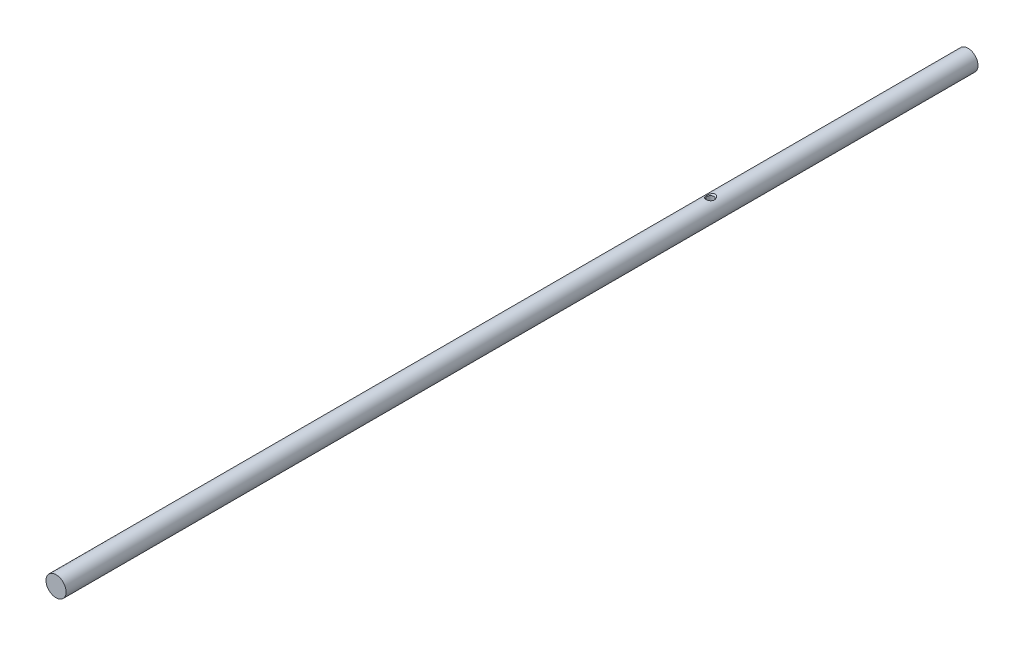
ISO-10303-21;
HEADER;
FILE_DESCRIPTION(('STEP AP214'),'2;1');
FILE_NAME('part.step','',(''),(''),'','','');
FILE_SCHEMA(('AUTOMOTIVE_DESIGN { 1 0 10303 214 1 1 1 1 }'));
ENDSEC;
DATA;
#1=APPLICATION_CONTEXT('core data for automotive mechanical design processes');
#2=APPLICATION_PROTOCOL_DEFINITION('international standard','automotive_design',2000,#1);
#3=PRODUCT_CONTEXT('',#1,'mechanical');
#4=PRODUCT('Part','Part','',(#3));
#5=PRODUCT_RELATED_PRODUCT_CATEGORY('part','',(#4));
#6=PRODUCT_DEFINITION_FORMATION('','',#4);
#7=PRODUCT_DEFINITION_CONTEXT('part definition',#1,'design');
#8=PRODUCT_DEFINITION('design','',#6,#7);
#9=PRODUCT_DEFINITION_SHAPE('','',#8);
#10=(LENGTH_UNIT() NAMED_UNIT(*) SI_UNIT(.MILLI.,.METRE.));
#11=(NAMED_UNIT(*) PLANE_ANGLE_UNIT() SI_UNIT($,.RADIAN.));
#12=(NAMED_UNIT(*) SI_UNIT($,.STERADIAN.) SOLID_ANGLE_UNIT());
#13=UNCERTAINTY_MEASURE_WITH_UNIT(LENGTH_MEASURE(1.E-05),#10,'distance_accuracy_value','');
#14=(GEOMETRIC_REPRESENTATION_CONTEXT(3) GLOBAL_UNCERTAINTY_ASSIGNED_CONTEXT((#13)) GLOBAL_UNIT_ASSIGNED_CONTEXT((#10,
#11,#12)) REPRESENTATION_CONTEXT('',''));
#15=CARTESIAN_POINT('',(0.,0.,0.));
#16=DIRECTION('',(0.,0.,1.));
#17=DIRECTION('',(1.,0.,0.));
#18=AXIS2_PLACEMENT_3D('',#15,#16,#17);
#19=CARTESIAN_POINT('',(0.,0.,431.8));
#20=DIRECTION('',(0.,0.,-1.));
#21=DIRECTION('',(-1.,0.,0.));
#22=AXIS2_PLACEMENT_3D('',#19,#20,#21);
#23=CYLINDRICAL_SURFACE('',#22,4.7625);
#24=CARTESIAN_POINT('',(0.,-4.7625,123.5075));
#25=CARTESIAN_POINT('',(0.0866193385826811,-4.76250024290249,123.507500402799));
#26=CARTESIAN_POINT('',(0.173236246329956,-4.76011509093227,123.500387577523));
#27=CARTESIAN_POINT('',(0.343918795385852,-4.75083521197708,123.472211289753));
#28=CARTESIAN_POINT('',(0.427984170888632,-4.74394001683417,123.451146378981));
#29=CARTESIAN_POINT('',(0.591078303334076,-4.72638926301478,123.395868201128));
#30=CARTESIAN_POINT('',(0.670115223594084,-4.7157399927273,123.361676913346));
#31=CARTESIAN_POINT('',(0.821332712178457,-4.6917680757628,123.281215888119));
#32=CARTESIAN_POINT('',(0.89351192417195,-4.67844490185097,123.234943768058));
#33=CARTESIAN_POINT('',(1.03146490909785,-4.6500112492827,123.129951534787));
#34=CARTESIAN_POINT('',(1.09696837422357,-4.63485795886258,123.070887915611));
#35=CARTESIAN_POINT('',(1.21734689966456,-4.60470749718205,122.942719641903));
#36=CARTESIAN_POINT('',(1.27221961946453,-4.58971036098746,122.873612782051));
#37=CARTESIAN_POINT('',(1.37132209578673,-4.56109915307672,122.724886129626));
#38=CARTESIAN_POINT('',(1.41520046242589,-4.54753724850155,122.645021188175));
#39=CARTESIAN_POINT('',(1.48878746228089,-4.52398297352029,122.478520450047));
#40=CARTESIAN_POINT('',(1.51850041960149,-4.51398951405184,122.391886729004));
#41=CARTESIAN_POINT('',(1.5618991201458,-4.49915443940136,122.217381260874));
#42=CARTESIAN_POINT('',(1.57609134913144,-4.49415052034258,122.129649681524));
#43=CARTESIAN_POINT('',(1.58962903329349,-4.48938104899343,121.952918790278));
#44=CARTESIAN_POINT('',(1.58897907629749,-4.48961387798584,121.863919878624));
#45=CARTESIAN_POINT('',(1.57324409712918,-4.49514936325486,121.69150059917));
#46=CARTESIAN_POINT('',(1.55882008715261,-4.50021985189708,121.608011160366));
#47=CARTESIAN_POINT('',(1.51702478352346,-4.51447944137724,121.444712946374));
#48=CARTESIAN_POINT('',(1.4896519397146,-4.52366903532271,121.364904613122));
#49=CARTESIAN_POINT('',(1.42230325467059,-4.54529683920857,121.209732260024));
#50=CARTESIAN_POINT('',(1.38213155232279,-4.55778498196574,121.134460509567));
#51=CARTESIAN_POINT('',(1.29046145625624,-4.58458186738965,120.991517433106));
#52=CARTESIAN_POINT('',(1.23895979087786,-4.59889113542361,120.923848310993));
#53=CARTESIAN_POINT('',(1.12291706563306,-4.62863135053788,120.79431708792));
#54=CARTESIAN_POINT('',(1.05783562574615,-4.64408185600813,120.732942597467));
#55=CARTESIAN_POINT('',(0.918114067327482,-4.67371014689421,120.621851614172));
#56=CARTESIAN_POINT('',(0.843473033111548,-4.68788781016682,120.572136239414));
#57=CARTESIAN_POINT('',(0.685716835710956,-4.71355908851247,120.485382123377));
#58=CARTESIAN_POINT('',(0.602524951310941,-4.72502468137762,120.448474032497));
#59=CARTESIAN_POINT('',(0.430639669841163,-4.7437765034179,120.389327461345));
#60=CARTESIAN_POINT('',(0.341948195570995,-4.75106418427121,120.367083885265));
#61=CARTESIAN_POINT('',(0.165709329377775,-4.76039857975912,120.338761630189));
#62=CARTESIAN_POINT('',(0.078278989785449,-4.76265877911043,120.332024052938));
#63=CARTESIAN_POINT('',(-0.0964804235618707,-4.76232383028039,120.333028119338));
#64=CARTESIAN_POINT('',(-0.183809511919939,-4.75972950165738,120.340767318968));
#65=CARTESIAN_POINT('',(-0.353250287757999,-4.75011789238403,120.369983903531));
#66=CARTESIAN_POINT('',(-0.435439830850306,-4.74323090454018,120.391056852104));
#67=CARTESIAN_POINT('',(-0.595083834245064,-4.72585806842736,120.445837093091));
#68=CARTESIAN_POINT('',(-0.672537689257405,-4.71537176124097,120.479545996655));
#69=CARTESIAN_POINT('',(-0.822782670524314,-4.69152178418573,120.559624310547));
#70=CARTESIAN_POINT('',(-0.895397560257214,-4.67808968424811,120.606303416837));
#71=CARTESIAN_POINT('',(-1.03197791784024,-4.64987090592067,120.710633213146));
#72=CARTESIAN_POINT('',(-1.09594073387547,-4.63508381455202,120.76828725395));
#73=CARTESIAN_POINT('',(-1.21642585614249,-4.60496996168956,120.896028767223));
#74=CARTESIAN_POINT('',(-1.27247803867765,-4.58964920726292,120.966562147746));
#75=CARTESIAN_POINT('',(-1.37200881668866,-4.5608870760535,121.1163623639));
#76=CARTESIAN_POINT('',(-1.41548730734047,-4.54744571493929,121.195629272332));
#77=CARTESIAN_POINT('',(-1.48843512703596,-4.52409546968822,121.360680911773));
#78=CARTESIAN_POINT('',(-1.51793278481196,-4.51417945258854,121.44645205068));
#79=CARTESIAN_POINT('',(-1.56193278348047,-4.49914696286489,121.622151106945));
#80=CARTESIAN_POINT('',(-1.57644187973937,-4.49402832815028,121.712077132579));
#81=CARTESIAN_POINT('',(-1.58952609843277,-4.48941600962757,121.888562889965));
#82=CARTESIAN_POINT('',(-1.58888153347707,-4.48964685408647,121.975058215205));
#83=CARTESIAN_POINT('',(-1.57359714084979,-4.4950264084539,122.146639556439));
#84=CARTESIAN_POINT('',(-1.55895814614049,-4.50017482566362,122.231725656004));
#85=CARTESIAN_POINT('',(-1.51665275334282,-4.51460432334016,122.396465365016));
#86=CARTESIAN_POINT('',(-1.48923906179962,-4.52380505610683,122.476191459695));
#87=CARTESIAN_POINT('',(-1.42236724314359,-4.54527283124319,122.629973508514));
#88=CARTESIAN_POINT('',(-1.38290644257916,-4.55754055411887,122.704028199511));
#89=CARTESIAN_POINT('',(-1.29105134947619,-4.58442741396349,122.847867826003));
#90=CARTESIAN_POINT('',(-1.23816783538877,-4.59912579731893,122.917325446764));
#91=CARTESIAN_POINT('',(-1.12179557697784,-4.62888578099664,123.046632578747));
#92=CARTESIAN_POINT('',(-1.05830383406673,-4.64394748298391,123.106479363905));
#93=CARTESIAN_POINT('',(-0.91954597161159,-4.67344173459301,123.217216754509));
#94=CARTESIAN_POINT('',(-0.843917402680815,-4.68782688609495,123.267667402055));
#95=CARTESIAN_POINT('',(-0.684779804883012,-4.71370010986522,123.3550848058));
#96=CARTESIAN_POINT('',(-0.6012727975351,-4.72518892253839,123.392055009151));
#97=CARTESIAN_POINT('',(-0.432583664931546,-4.7435375517131,123.449908091576));
#98=CARTESIAN_POINT('',(-0.347643065311295,-4.75058124720755,123.471435915193));
#99=CARTESIAN_POINT('',(-0.175133660416261,-4.76006171214452,123.500229695575));
#100=CARTESIAN_POINT('',(-0.0875655880903781,-4.76249975444399,123.507499592801));
#101=CARTESIAN_POINT('',(0.,-4.7625,123.5075));
#102=B_SPLINE_CURVE_WITH_KNOTS('',3,(#24,#25,#26,#27,#28,#29,#30,#31,#32,#33,#34,#35,#36,#37,
#38,#39,#40,#41,#42,#43,#44,#45,#46,#47,#48,#49,#50,#51,#52,#53,#54,#55,#56,#57,#58,#59,#60,#61,
#62,#63,#64,#65,#66,#67,#68,#69,#70,#71,#72,#73,#74,#75,#76,#77,#78,#79,#80,#81,#82,#83,#84,#85,
#86,#87,#88,#89,#90,#91,#92,#93,#94,#95,#96,#97,#98,#99,#100,#101),.UNSPECIFIED.,.T.,.F.,(4,2,2,
2,2,2,2,2,2,2,2,2,2,2,2,2,2,2,2,2,2,2,2,2,2,2,2,2,2,2,2,2,2,2,2,2,2,2,4),(0.,0.259535780816293,
0.519098506612188,0.778228493181555,1.03740962475606,1.30468186298875,1.57201287843955,
1.84703060907258,2.12196433449873,2.38763057115172,2.65321468955132,2.90666212150156,
3.16013990233076,3.41769971708768,3.67533400311153,3.94641872975545,4.21752944222006,
4.49132968969942,4.76503474342568,5.02687563290581,5.2886723214813,5.54288575790414,
5.79713161888514,6.05806509751931,6.31907837054751,6.59195123823192,6.86482638073057,
7.13714621949998,7.40934326970521,7.6675561987701,7.92575375970307,8.17904744490162,
8.43239738104362,8.69680230873237,8.96128210158997,9.2360696157572,9.51078681329522,
9.77323036418427,10.0356013733555),.UNSPECIFIED.);
#103=CARTESIAN_POINT('',(0.,-4.7625,123.5075));
#104=VERTEX_POINT('',#103);
#105=EDGE_CURVE('E10',#104,#104,#102,.T.);
#106=ORIENTED_EDGE('',*,*,#105,.T.);
#107=EDGE_LOOP('',(#106));
#108=FACE_BOUND('',#107,.T.);
#109=CARTESIAN_POINT('',(-1.39006953477609,4.55511951567454,120.46109190345));
#110=CARTESIAN_POINT('',(-1.3323247045587,4.57274010446215,120.381729915836));
#111=CARTESIAN_POINT('',(-1.2692889318351,4.59078301063698,120.306328626598));
#112=CARTESIAN_POINT('',(-1.13286250047884,4.62633657766027,120.165374029366));
#113=CARTESIAN_POINT('',(-1.05947770418128,4.6438475330602,120.099815189103));
#114=CARTESIAN_POINT('',(-0.907507765814439,4.67584216233833,119.984393388722));
#115=CARTESIAN_POINT('',(-0.829478932994571,4.69044307248934,119.933836027064));
#116=CARTESIAN_POINT('',(-0.66579733851462,4.71645726102881,119.845841895005));
#117=CARTESIAN_POINT('',(-0.580147478329218,4.72787174576214,119.808400157806));
#118=CARTESIAN_POINT('',(-0.402493987945379,4.74630583874131,119.748702140558));
#119=CARTESIAN_POINT('',(-0.310449562592671,4.7532936670759,119.726555567743));
#120=CARTESIAN_POINT('',(-0.123616967413238,4.76181070932381,119.699632349466));
#121=CARTESIAN_POINT('',(-0.028830902528087,4.76334400449143,119.694842716943));
#122=CARTESIAN_POINT('',(0.148552374890812,4.76090988158228,119.702502327666));
#123=CARTESIAN_POINT('',(0.231252550108788,4.75757792079126,119.712959866325));
#124=CARTESIAN_POINT('',(0.393644251721062,4.74690149622819,119.746912042062));
#125=CARTESIAN_POINT('',(0.473335424455112,4.73955656235494,119.770408206561));
#126=CARTESIAN_POINT('',(0.628510829133786,4.72149837367876,119.829358568401));
#127=CARTESIAN_POINT('',(0.703952053911404,4.71075615343793,119.864915795544));
#128=CARTESIAN_POINT('',(0.848634005705198,4.68685532685706,119.946282220313));
#129=CARTESIAN_POINT('',(0.917872459726432,4.67369584005862,119.992095154782));
#130=CARTESIAN_POINT('',(1.05936329125982,4.64382892932193,120.099931253796));
#131=CARTESIAN_POINT('',(1.13049314598801,4.62688579063581,120.16335743875));
#132=CARTESIAN_POINT('',(1.26306376442512,4.59246941064331,120.2994918664));
#133=CARTESIAN_POINT('',(1.32449790649953,4.57499581669326,120.372206391719));
#134=CARTESIAN_POINT('',(1.44873306669326,4.53735606518168,120.540440153744));
#135=CARTESIAN_POINT('',(1.5093499500381,4.51735036537421,120.637611712658));
#136=CARTESIAN_POINT('',(1.61601796478081,4.48029935034065,120.840174345203));
#137=CARTESIAN_POINT('',(1.66205996655251,4.46325589364936,120.945570519375));
#138=CARTESIAN_POINT('',(1.74479101553617,4.43163204276963,121.177748602152));
#139=CARTESIAN_POINT('',(1.77921689520788,4.41774723560563,121.30543953211));
#140=CARTESIAN_POINT('',(1.82823617759181,4.39768850878416,121.565146970895));
#141=CARTESIAN_POINT('',(1.84282903923902,4.3915147994937,121.69716359763));
#142=CARTESIAN_POINT('',(1.85208594471471,4.38762119888589,121.966126366498));
#143=CARTESIAN_POINT('',(1.84612013120192,4.3901684776292,122.103098760717));
#144=CARTESIAN_POINT('',(1.81295598430219,4.40396519051612,122.37404400005));
#145=CARTESIAN_POINT('',(1.78574948387064,4.41521797191059,122.508015670998));
#146=CARTESIAN_POINT('',(1.71054835891838,4.44489074130652,122.769038001977));
#147=CARTESIAN_POINT('',(1.66256961768622,4.46330525207055,122.896093866715));
#148=CARTESIAN_POINT('',(1.54626762891779,4.50491578355043,123.139726333239));
#149=CARTESIAN_POINT('',(1.47794993659457,4.52811049810923,123.256305785161));
#150=CARTESIAN_POINT('',(1.33476402792858,4.57213474302864,123.456238807107));
#151=CARTESIAN_POINT('',(1.26298871313551,4.59269511291413,123.541870566455));
#152=CARTESIAN_POINT('',(1.10613009884027,4.63297023516788,123.70016078477));
#153=CARTESIAN_POINT('',(1.02106533744053,4.65268611745873,123.772837018135));
#154=CARTESIAN_POINT('',(0.85547499644087,4.68564984501986,123.889784332494));
#155=CARTESIAN_POINT('',(0.777012753756744,4.69941975289598,123.936822550944));
#156=CARTESIAN_POINT('',(0.613052200479427,4.72360229139768,124.017732093054));
#157=CARTESIAN_POINT('',(0.527558295666311,4.73401700444946,124.051611586468));
#158=CARTESIAN_POINT('',(0.35094887934444,4.75038336040292,124.104285539601));
#159=CARTESIAN_POINT('',(0.259800167251795,4.75630527538399,124.122979576796));
#160=CARTESIAN_POINT('',(0.0754377688409472,4.76279345044587,124.143442571864));
#161=CARTESIAN_POINT('',(-0.0177747711199697,4.76336261245442,124.145220700491));
#162=CARTESIAN_POINT('',(-0.192609797053926,4.75931876531429,124.132487788037));
#163=CARTESIAN_POINT('',(-0.274381528988066,4.75526765046857,124.119743086442));
#164=CARTESIAN_POINT('',(-0.434597669922153,4.74330979551371,124.081584136107));
#165=CARTESIAN_POINT('',(-0.513041613568959,4.73540251808356,124.056168121726));
#166=CARTESIAN_POINT('',(-0.666686417381075,4.7162571563539,123.99330382835));
#167=CARTESIAN_POINT('',(-0.741764889884094,4.70494395293021,123.955582387839));
#168=CARTESIAN_POINT('',(-0.88545881116446,4.68003170152353,123.870011472337));
#169=CARTESIAN_POINT('',(-0.954071676288765,4.66643174574906,123.822157973174));
#170=CARTESIAN_POINT('',(-1.09452128584558,4.63566506207894,123.709662472101));
#171=CARTESIAN_POINT('',(-1.1651368630844,4.61827500376589,123.643560953465));
#172=CARTESIAN_POINT('',(-1.29632453110408,4.58318318586232,123.502134953821));
#173=CARTESIAN_POINT('',(-1.3568896008024,4.56548121784787,123.426804088706));
#174=CARTESIAN_POINT('',(-1.47880610179838,4.52762560189305,123.252951428128));
#175=CARTESIAN_POINT('',(-1.53790694834735,4.50768678683063,123.152800337197));
#176=CARTESIAN_POINT('',(-1.6410628209028,4.47116482209243,122.944453545045));
#177=CARTESIAN_POINT('',(-1.68510910004014,4.45458362550203,122.836253211425));
#178=CARTESIAN_POINT('',(-1.76269185518213,4.42451125064605,122.599372659544));
#179=CARTESIAN_POINT('',(-1.79405137921614,4.41172435416753,122.469882577377));
#180=CARTESIAN_POINT('',(-1.8366188309724,4.39417473821109,122.207110774655));
#181=CARTESIAN_POINT('',(-1.84782600984914,4.38941231691685,122.073828913387));
#182=CARTESIAN_POINT('',(-1.84992500626868,4.38852950985413,121.803868215996));
#183=CARTESIAN_POINT('',(-1.84032362553499,4.39261892484159,121.667184504224));
#184=CARTESIAN_POINT('',(-1.7999540033017,4.40931289607424,121.397473460992));
#185=CARTESIAN_POINT('',(-1.76917981014375,4.42191984657299,121.264447168567));
#186=CARTESIAN_POINT('',(-1.68958275813264,4.45290955940209,121.014218777936));
#187=CARTESIAN_POINT('',(-1.64205414670648,4.47086663448547,120.89654956924));
#188=CARTESIAN_POINT('',(-1.52925441241413,4.51069375537069,120.670792180413));
#189=CARTESIAN_POINT('',(-1.46399809378313,4.53256053103436,120.562696105283));
#190=CARTESIAN_POINT('',(-1.39006953477609,4.55511951567454,120.46109190345));
#191=B_SPLINE_CURVE_WITH_KNOTS('',3,(#109,#110,#111,#112,#113,#114,#115,#116,#117,#118,#119,
#120,#121,#122,#123,#124,#125,#126,#127,#128,#129,#130,#131,#132,#133,#134,#135,#136,#137,#138,
#139,#140,#141,#142,#143,#144,#145,#146,#147,#148,#149,#150,#151,#152,#153,#154,#155,#156,#157,
#158,#159,#160,#161,#162,#163,#164,#165,#166,#167,#168,#169,#170,#171,#172,#173,#174,#175,#176,
#177,#178,#179,#180,#181,#182,#183,#184,#185,#186,#187,#188,#189,#190),.UNSPECIFIED.,.T.,.F.,(4,
2,2,2,2,2,2,2,2,2,2,2,2,2,2,2,2,2,2,2,2,2,2,2,2,2,2,2,2,2,2,2,2,2,2,2,2,2,2,2,4),(0.,
0.29887223894527,0.597575852945968,0.878784775217393,1.15988709011747,1.44298528598449,
1.72587161421815,1.9749520404514,2.22406165156083,2.47535519909821,2.7267404592438,
3.01606970876733,3.30559570697568,3.65302870507795,4.00067890463275,4.397798555047,
4.79492903907366,5.20433320878447,5.61389487198083,6.02314391946952,6.43228129044543,
6.77179758323297,7.1108444286609,7.38727163137459,7.66352693550341,7.94159459441513,
8.21951149374406,8.46692665010045,8.71437629135192,8.96774245590139,9.2212094398643,
9.51496625186063,9.80892742036761,10.1614955922137,10.5142682632034,10.913959914061,
11.3136664168433,11.7229500481351,12.1323487757151,12.5153026134319,12.8979376280168),.UNSPECIFIED.);
#192=CARTESIAN_POINT('',(-1.39006953477609,4.55511951567454,120.46109190345));
#193=VERTEX_POINT('',#192);
#194=EDGE_CURVE('E43',#193,#193,#191,.T.);
#195=ORIENTED_EDGE('',*,*,#194,.T.);
#196=EDGE_LOOP('',(#195));
#197=FACE_BOUND('',#196,.T.);
#198=CARTESIAN_POINT('',(0.,0.,431.8));
#199=DIRECTION('',(0.,0.,1.));
#200=DIRECTION('',(1.,0.,0.));
#201=AXIS2_PLACEMENT_3D('',#198,#199,#200);
#202=CIRCLE('',#201,4.7625);
#203=CARTESIAN_POINT('',(4.7625,0.,431.8));
#204=VERTEX_POINT('',#203);
#205=EDGE_CURVE('E47',#204,#204,#202,.T.);
#206=ORIENTED_EDGE('',*,*,#205,.F.);
#207=EDGE_LOOP('',(#206));
#208=FACE_BOUND('',#207,.T.);
#209=CARTESIAN_POINT('',(0.,0.,0.));
#210=DIRECTION('',(0.,0.,1.));
#211=DIRECTION('',(1.,0.,0.));
#212=AXIS2_PLACEMENT_3D('',#209,#210,#211);
#213=CIRCLE('',#212,4.7625);
#214=CARTESIAN_POINT('',(4.7625,0.,0.));
#215=VERTEX_POINT('',#214);
#216=EDGE_CURVE('E51',#215,#215,#213,.T.);
#217=ORIENTED_EDGE('',*,*,#216,.T.);
#218=EDGE_LOOP('',(#217));
#219=FACE_BOUND('',#218,.T.);
#220=ADVANCED_FACE('F33',(#108,#197,#208,#219),#23,.T.);
#221=CARTESIAN_POINT('',(0.,0.,431.8));
#222=DIRECTION('',(0.,0.,1.));
#223=DIRECTION('',(1.,0.,0.));
#224=AXIS2_PLACEMENT_3D('',#221,#222,#223);
#225=PLANE('',#224);
#226=ORIENTED_EDGE('',*,*,#205,.T.);
#227=EDGE_LOOP('',(#226));
#228=FACE_BOUND('',#227,.T.);
#229=ADVANCED_FACE('F67',(#228),#225,.T.);
#230=CARTESIAN_POINT('',(0.,0.,0.));
#231=DIRECTION('',(0.,0.,1.));
#232=DIRECTION('',(1.,0.,0.));
#233=AXIS2_PLACEMENT_3D('',#230,#231,#232);
#234=PLANE('',#233);
#235=ORIENTED_EDGE('',*,*,#216,.F.);
#236=EDGE_LOOP('',(#235));
#237=FACE_BOUND('',#236,.T.);
#238=ADVANCED_FACE('F65',(#237),#234,.F.);
#239=CARTESIAN_POINT('',(0.,4.7625,121.92));
#240=DIRECTION('',(0.,1.,0.));
#241=DIRECTION('',(0.,0.,1.));
#242=AXIS2_PLACEMENT_3D('',#239,#240,#241);
#243=CYLINDRICAL_SURFACE('',#242,1.5875);
#244=CARTESIAN_POINT('',(0.,4.1275,121.92));
#245=DIRECTION('',(0.,1.,0.));
#246=DIRECTION('',(0.,0.,1.));
#247=AXIS2_PLACEMENT_3D('',#244,#245,#246);
#248=CIRCLE('',#247,1.5875);
#249=CARTESIAN_POINT('',(0.,4.1275,123.5075));
#250=VERTEX_POINT('',#249);
#251=EDGE_CURVE('E82',#250,#250,#248,.T.);
#252=ORIENTED_EDGE('',*,*,#251,.T.);
#253=EDGE_LOOP('',(#252));
#254=FACE_BOUND('',#253,.T.);
#255=ORIENTED_EDGE('',*,*,#105,.F.);
#256=EDGE_LOOP('',(#255));
#257=FACE_BOUND('',#256,.T.);
#258=ADVANCED_FACE('F60',(#254,#257),#243,.F.);
#259=CARTESIAN_POINT('',(0.,4.7625,121.92));
#260=DIRECTION('',(0.,1.,0.));
#261=DIRECTION('',(0.,0.,1.));
#262=AXIS2_PLACEMENT_3D('',#259,#260,#261);
#263=CONICAL_SURFACE('',#262,2.2225,0.785398163397449);
#264=ORIENTED_EDGE('',*,*,#251,.F.);
#265=EDGE_LOOP('',(#264));
#266=FACE_BOUND('',#265,.T.);
#267=ORIENTED_EDGE('',*,*,#194,.F.);
#268=EDGE_LOOP('',(#267));
#269=FACE_BOUND('',#268,.T.);
#270=ADVANCED_FACE('F57',(#266,#269),#263,.F.);
#271=CLOSED_SHELL('',(#220,#229,#238,#258,#270));
#272=MANIFOLD_SOLID_BREP('B2',#271);
#273=ADVANCED_BREP_SHAPE_REPRESENTATION('',(#18,#272),#14);
#274=SHAPE_DEFINITION_REPRESENTATION(#9,#273);
ENDSEC;
END-ISO-10303-21;
